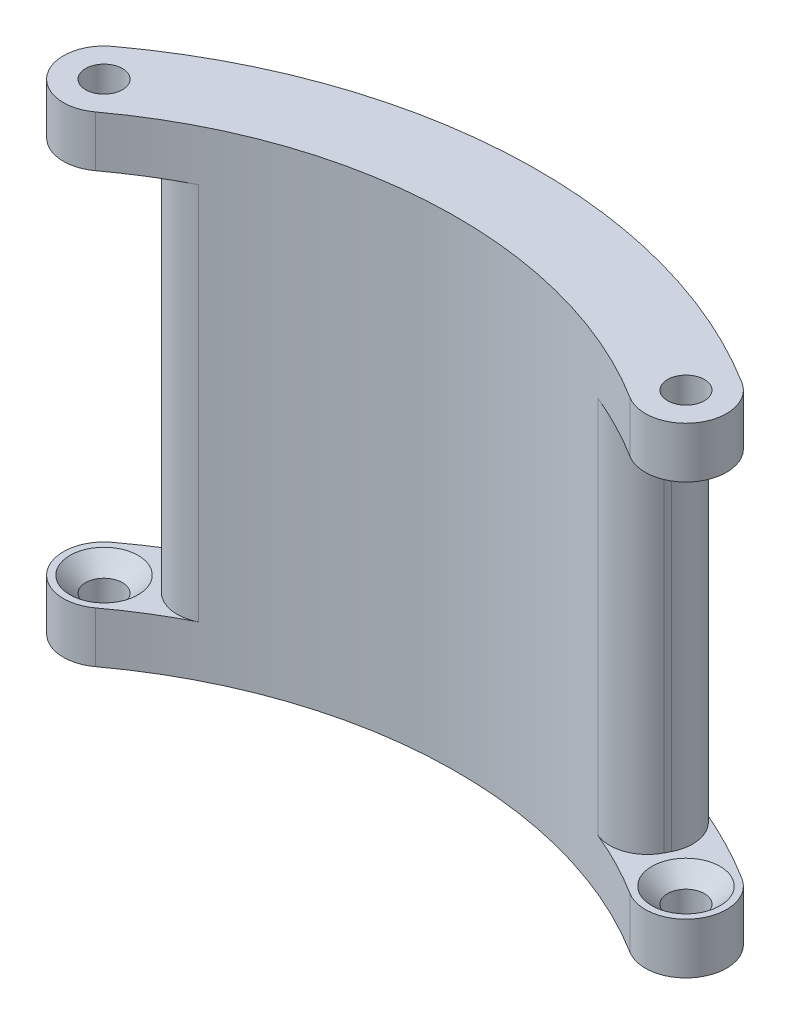
ISO-10303-21;
HEADER;
FILE_DESCRIPTION(('STEP AP214'),'2;1');
FILE_NAME('part.step','',(''),(''),'','','');
FILE_SCHEMA(('AUTOMOTIVE_DESIGN { 1 0 10303 214 1 1 1 1 }'));
ENDSEC;
DATA;
#1=APPLICATION_CONTEXT('core data for automotive mechanical design processes');
#2=APPLICATION_PROTOCOL_DEFINITION('international standard','automotive_design',2000,#1);
#3=PRODUCT_CONTEXT('',#1,'mechanical');
#4=PRODUCT('Part','Part','',(#3));
#5=PRODUCT_RELATED_PRODUCT_CATEGORY('part','',(#4));
#6=PRODUCT_DEFINITION_FORMATION('','',#4);
#7=PRODUCT_DEFINITION_CONTEXT('part definition',#1,'design');
#8=PRODUCT_DEFINITION('design','',#6,#7);
#9=PRODUCT_DEFINITION_SHAPE('','',#8);
#10=(LENGTH_UNIT() NAMED_UNIT(*) SI_UNIT(.MILLI.,.METRE.));
#11=(NAMED_UNIT(*) PLANE_ANGLE_UNIT() SI_UNIT($,.RADIAN.));
#12=(NAMED_UNIT(*) SI_UNIT($,.STERADIAN.) SOLID_ANGLE_UNIT());
#13=UNCERTAINTY_MEASURE_WITH_UNIT(LENGTH_MEASURE(1.E-05),#10,'distance_accuracy_value','');
#14=(GEOMETRIC_REPRESENTATION_CONTEXT(3) GLOBAL_UNCERTAINTY_ASSIGNED_CONTEXT((#13)) GLOBAL_UNIT_ASSIGNED_CONTEXT((#10,
#11,#12)) REPRESENTATION_CONTEXT('',''));
#15=CARTESIAN_POINT('',(0.,0.,0.));
#16=DIRECTION('',(0.,0.,1.));
#17=DIRECTION('',(1.,0.,0.));
#18=AXIS2_PLACEMENT_3D('',#15,#16,#17);
#19=CARTESIAN_POINT('',(12.1963109176505,4.699,-19.5));
#20=DIRECTION('',(0.,-1.,0.));
#21=DIRECTION('',(0.,0.,-1.));
#22=AXIS2_PLACEMENT_3D('',#19,#20,#21);
#23=PLANE('',#22);
#24=CARTESIAN_POINT('',(24.3926218353009,4.69899999999995,-39.));
#25=DIRECTION('',(0.,1.,0.));
#26=DIRECTION('',(0.,0.,1.));
#27=AXIS2_PLACEMENT_3D('',#24,#25,#26);
#28=CIRCLE('',#27,3.15);
#29=CARTESIAN_POINT('',(24.3926218353009,4.69899999999995,-35.8500000000001));
#30=VERTEX_POINT('',#29);
#31=EDGE_CURVE('E215',#30,#30,#28,.T.);
#32=ORIENTED_EDGE('',*,*,#31,.F.);
#33=EDGE_LOOP('',(#32));
#34=FACE_BOUND('',#33,.T.);
#35=DIRECTION('',(0.454541757838843,0.,-0.890725429288271));
#36=VECTOR('',#35,1.);
#37=CARTESIAN_POINT('',(19.2043892686911,4.69899999999995,-37.6331493874295));
#38=LINE('',#37,#36);
#39=CARTESIAN_POINT('',(20.7343421689309,4.69899999999995,-40.6312632688389));
#40=VERTEX_POINT('',#39);
#41=CARTESIAN_POINT('',(20.9622737989176,4.69899999999995,-41.0779207991253));
#42=VERTEX_POINT('',#41);
#43=EDGE_CURVE('E204',#40,#42,#38,.T.);
#44=ORIENTED_EDGE('',*,*,#43,.F.);
#45=CARTESIAN_POINT('',(17.6168031664219,4.69899999999995,-42.2221594212748));
#46=DIRECTION('',(0.,-1.,0.));
#47=DIRECTION('',(0.,0.,-1.));
#48=AXIS2_PLACEMENT_3D('',#45,#46,#47);
#49=CIRCLE('',#48,3.5);
#50=CARTESIAN_POINT('',(16.2690695908486,4.69899999999995,-38.992048864456));
#51=VERTEX_POINT('',#50);
#52=EDGE_CURVE('E58',#40,#51,#49,.T.);
#53=ORIENTED_EDGE('',*,*,#52,.T.);
#54=CARTESIAN_POINT('',(0.,4.69900000000001,0.));
#55=DIRECTION('',(0.,-1.,0.));
#56=DIRECTION('',(0.,0.,-1.));
#57=AXIS2_PLACEMENT_3D('',#54,#55,#56);
#58=CIRCLE('',#57,42.25);
#59=CARTESIAN_POINT('',(22.4040928813362,4.69899999999995,-35.8206521739131));
#60=VERTEX_POINT('',#59);
#61=EDGE_CURVE('E228',#51,#60,#58,.T.);
#62=ORIENTED_EDGE('',*,*,#61,.T.);
#63=CARTESIAN_POINT('',(24.3926218353009,4.69899999999995,-39.));
#64=DIRECTION('',(0.,1.,0.));
#65=DIRECTION('',(0.,0.,-1.));
#66=AXIS2_PLACEMENT_3D('',#63,#64,#65);
#67=CIRCLE('',#66,3.75);
#68=CARTESIAN_POINT('',(26.3811507892657,4.69900000000001,-42.179347826087));
#69=VERTEX_POINT('',#68);
#70=EDGE_CURVE('E227',#60,#69,#67,.T.);
#71=ORIENTED_EDGE('',*,*,#70,.T.);
#72=CARTESIAN_POINT('',(0.,4.69900000000001,0.));
#73=DIRECTION('',(0.,1.,0.));
#74=DIRECTION('',(0.,0.,-1.));
#75=AXIS2_PLACEMENT_3D('',#72,#73,#74);
#76=CIRCLE('',#75,49.75);
#77=CARTESIAN_POINT('',(19.1951471593801,4.69900000000006,-45.8978085046524));
#78=VERTEX_POINT('',#77);
#79=EDGE_CURVE('E231',#69,#78,#76,.T.);
#80=ORIENTED_EDGE('',*,*,#79,.T.);
#81=CARTESIAN_POINT('',(17.8447347964087,4.69899999999995,-42.6688169515612));
#82=DIRECTION('',(0.,-1.,0.));
#83=DIRECTION('',(0.,0.,-1.));
#84=AXIS2_PLACEMENT_3D('',#81,#82,#83);
#85=CIRCLE('',#84,3.5);
#86=EDGE_CURVE('E44',#78,#42,#85,.T.);
#87=ORIENTED_EDGE('',*,*,#86,.T.);
#88=EDGE_LOOP('',(#44,#53,#62,#71,#80,#87));
#89=FACE_BOUND('',#88,.T.);
#90=ADVANCED_FACE('F36',(#34,#89),#23,.F.);
#91=CARTESIAN_POINT('',(-27.3313007374329,4.69899999999999,-37.));
#92=DIRECTION('',(0.,1.,0.));
#93=DIRECTION('',(0.,0.,1.));
#94=AXIS2_PLACEMENT_3D('',#91,#92,#93);
#95=CIRCLE('',#94,3.15);
#96=CARTESIAN_POINT('',(-27.3313007374329,4.69899999999999,-33.85));
#97=VERTEX_POINT('',#96);
#98=EDGE_CURVE('E206',#97,#97,#95,.T.);
#99=ORIENTED_EDGE('',*,*,#98,.F.);
#100=EDGE_LOOP('',(#99));
#101=FACE_BOUND('',#100,.T.);
#102=DIRECTION('',(0.521964813189454,0.,0.852967017997823));
#103=VECTOR('',#102,1.);
#104=CARTESIAN_POINT('',(-22.0530133572545,4.699,-36.037856510408));
#105=LINE('',#104,#103);
#106=CARTESIAN_POINT('',(-24.0716482892592,4.69899999999999,-39.3366018949046));
#107=VERTEX_POINT('',#106);
#108=CARTESIAN_POINT('',(-23.8099071211173,4.69899999999999,-38.908878458313));
#109=VERTEX_POINT('',#108);
#110=EDGE_CURVE('E163',#107,#109,#105,.T.);
#111=ORIENTED_EDGE('',*,*,#110,.F.);
#112=CARTESIAN_POINT('',(-21.0862637262669,4.69899999999999,-41.1634787410676));
#113=DIRECTION('',(0.,-1.,0.));
#114=DIRECTION('',(0.,0.,-1.));
#115=AXIS2_PLACEMENT_3D('',#112,#113,#114);
#116=CIRCLE('',#115,3.5);
#117=CARTESIAN_POINT('',(-22.6819809812275,4.699,-44.2785528079592));
#118=VERTEX_POINT('',#117);
#119=EDGE_CURVE('E278',#107,#118,#116,.T.);
#120=ORIENTED_EDGE('',*,*,#119,.T.);
#121=CARTESIAN_POINT('',(-29.5593959062454,4.69899999999999,-40.0163043478261));
#122=VERTEX_POINT('',#121);
#123=EDGE_CURVE('E230',#118,#122,#76,.T.);
#124=ORIENTED_EDGE('',*,*,#123,.T.);
#125=CARTESIAN_POINT('',(-27.3313007374329,4.69899999999999,-37.));
#126=DIRECTION('',(0.,1.,0.));
#127=DIRECTION('',(0.,0.,1.));
#128=AXIS2_PLACEMENT_3D('',#125,#126,#127);
#129=CIRCLE('',#128,3.75);
#130=CARTESIAN_POINT('',(-25.1032055686204,4.69899999999999,-33.983695652174));
#131=VERTEX_POINT('',#130);
#132=EDGE_CURVE('E233',#122,#131,#129,.T.);
#133=ORIENTED_EDGE('',*,*,#132,.T.);
#134=CARTESIAN_POINT('',(-19.2313896848257,4.69900000000001,-37.6193587238057));
#135=VERTEX_POINT('',#134);
#136=EDGE_CURVE('E225',#131,#135,#58,.T.);
#137=ORIENTED_EDGE('',*,*,#136,.T.);
#138=CARTESIAN_POINT('',(-20.8245225581249,4.69899999999999,-40.7357553044761));
#139=DIRECTION('',(0.,-1.,0.));
#140=DIRECTION('',(0.,0.,-1.));
#141=AXIS2_PLACEMENT_3D('',#138,#139,#140);
#142=CIRCLE('',#141,3.5);
#143=EDGE_CURVE('E273',#135,#109,#142,.T.);
#144=ORIENTED_EDGE('',*,*,#143,.T.);
#145=EDGE_LOOP('',(#111,#120,#124,#133,#137,#144));
#146=FACE_BOUND('',#145,.T.);
#147=ADVANCED_FACE('F307',(#101,#146),#23,.F.);
#148=CARTESIAN_POINT('',(0.,4.69900000000001,0.));
#149=DIRECTION('',(0.,-1.,0.));
#150=DIRECTION('',(0.,0.,-1.));
#151=AXIS2_PLACEMENT_3D('',#148,#149,#150);
#152=CYLINDRICAL_SURFACE('',#151,42.25);
#153=DIRECTION('',(0.,-1.,0.));
#154=VECTOR('',#153,1.);
#155=CARTESIAN_POINT('',(-19.2313896848257,4.69900000000001,-37.6193587238057));
#156=LINE('',#155,#154);
#157=CARTESIAN_POINT('',(-19.2313896848258,39.651,-37.6193587238058));
#158=VERTEX_POINT('',#157);
#159=EDGE_CURVE('E256',#158,#135,#156,.T.);
#160=ORIENTED_EDGE('',*,*,#159,.T.);
#161=ORIENTED_EDGE('',*,*,#136,.F.);
#162=DIRECTION('',(0.,-1.,0.));
#163=VECTOR('',#162,1.);
#164=CARTESIAN_POINT('',(-25.1032055686204,4.69899999999999,-33.983695652174));
#165=LINE('',#164,#163);
#166=CARTESIAN_POINT('',(-25.1032055686205,0.,-33.983695652174));
#167=VERTEX_POINT('',#166);
#168=EDGE_CURVE('E235',#131,#167,#165,.T.);
#169=ORIENTED_EDGE('',*,*,#168,.T.);
#170=CARTESIAN_POINT('',(0.,0.,0.));
#171=DIRECTION('',(0.,-1.,0.));
#172=DIRECTION('',(0.,0.,-1.));
#173=AXIS2_PLACEMENT_3D('',#170,#171,#172);
#174=CIRCLE('',#173,42.25);
#175=CARTESIAN_POINT('',(22.4040928813362,0.,-35.8206521739131));
#176=VERTEX_POINT('',#175);
#177=EDGE_CURVE('E224',#167,#176,#174,.T.);
#178=ORIENTED_EDGE('',*,*,#177,.T.);
#179=DIRECTION('',(0.,-1.,0.));
#180=VECTOR('',#179,1.);
#181=CARTESIAN_POINT('',(22.4040928813362,4.69899999999995,-35.8206521739131));
#182=LINE('',#181,#180);
#183=EDGE_CURVE('E252',#60,#176,#182,.T.);
#184=ORIENTED_EDGE('',*,*,#183,.F.);
#185=ORIENTED_EDGE('',*,*,#61,.F.);
#186=DIRECTION('',(0.,-1.,0.));
#187=VECTOR('',#186,1.);
#188=CARTESIAN_POINT('',(16.2690695908486,4.69899999999995,-38.992048864456));
#189=LINE('',#188,#187);
#190=CARTESIAN_POINT('',(16.2690695908486,39.651,-38.992048864456));
#191=VERTEX_POINT('',#190);
#192=EDGE_CURVE('E170',#51,#191,#189,.F.);
#193=ORIENTED_EDGE('',*,*,#192,.T.);
#194=CARTESIAN_POINT('',(0.,39.651,0.));
#195=DIRECTION('',(0.,-1.,0.));
#196=DIRECTION('',(0.,0.,-1.));
#197=AXIS2_PLACEMENT_3D('',#194,#195,#196);
#198=CIRCLE('',#197,42.25);
#199=CARTESIAN_POINT('',(22.4040928813362,39.651,-35.8206521739131));
#200=VERTEX_POINT('',#199);
#201=EDGE_CURVE('E167',#191,#200,#198,.T.);
#202=ORIENTED_EDGE('',*,*,#201,.T.);
#203=DIRECTION('',(0.,1.,0.));
#204=VECTOR('',#203,1.);
#205=CARTESIAN_POINT('',(22.4040928813362,39.651,-35.8206521739131));
#206=LINE('',#205,#204);
#207=CARTESIAN_POINT('',(22.4040928813361,44.35,-35.8206521739131));
#208=VERTEX_POINT('',#207);
#209=EDGE_CURVE('E151',#200,#208,#206,.T.);
#210=ORIENTED_EDGE('',*,*,#209,.T.);
#211=CARTESIAN_POINT('',(0.,44.35,0.));
#212=DIRECTION('',(0.,-1.,0.));
#213=DIRECTION('',(0.,0.,-1.));
#214=AXIS2_PLACEMENT_3D('',#211,#212,#213);
#215=CIRCLE('',#214,42.25);
#216=CARTESIAN_POINT('',(-25.1032055686205,44.35,-33.983695652174));
#217=VERTEX_POINT('',#216);
#218=EDGE_CURVE('E188',#217,#208,#215,.T.);
#219=ORIENTED_EDGE('',*,*,#218,.F.);
#220=DIRECTION('',(0.,1.,0.));
#221=VECTOR('',#220,1.);
#222=CARTESIAN_POINT('',(-25.1032055686204,39.651,-33.9836956521739));
#223=LINE('',#222,#221);
#224=CARTESIAN_POINT('',(-25.1032055686204,39.651,-33.9836956521739));
#225=VERTEX_POINT('',#224);
#226=EDGE_CURVE('E187',#225,#217,#223,.T.);
#227=ORIENTED_EDGE('',*,*,#226,.F.);
#228=EDGE_CURVE('E173',#225,#158,#198,.T.);
#229=ORIENTED_EDGE('',*,*,#228,.T.);
#230=EDGE_LOOP('',(#160,#161,#169,#178,#184,#185,#193,#202,#210,#219,#227,#229));
#231=FACE_BOUND('',#230,.T.);
#232=ADVANCED_FACE('F169',(#231),#152,.F.);
#233=CARTESIAN_POINT('',(24.3926218353009,4.69899999999995,-39.));
#234=DIRECTION('',(0.,-1.,0.));
#235=DIRECTION('',(0.,0.,-1.));
#236=AXIS2_PLACEMENT_3D('',#233,#234,#235);
#237=CYLINDRICAL_SURFACE('',#236,3.75);
#238=CARTESIAN_POINT('',(24.3926218353009,0.,-39.));
#239=DIRECTION('',(0.,1.,0.));
#240=DIRECTION('',(0.,0.,-1.));
#241=AXIS2_PLACEMENT_3D('',#238,#239,#240);
#242=CIRCLE('',#241,3.75);
#243=CARTESIAN_POINT('',(26.3811507892656,0.,-42.179347826087));
#244=VERTEX_POINT('',#243);
#245=EDGE_CURVE('E238',#176,#244,#242,.T.);
#246=ORIENTED_EDGE('',*,*,#245,.T.);
#247=DIRECTION('',(0.,-1.,0.));
#248=VECTOR('',#247,1.);
#249=CARTESIAN_POINT('',(26.3811507892657,4.69900000000001,-42.179347826087));
#250=LINE('',#249,#248);
#251=EDGE_CURVE('E249',#69,#244,#250,.T.);
#252=ORIENTED_EDGE('',*,*,#251,.F.);
#253=ORIENTED_EDGE('',*,*,#70,.F.);
#254=ORIENTED_EDGE('',*,*,#183,.T.);
#255=EDGE_LOOP('',(#246,#252,#253,#254));
#256=FACE_BOUND('',#255,.T.);
#257=ADVANCED_FACE('F330',(#256),#237,.T.);
#258=CARTESIAN_POINT('',(0.,4.69900000000001,0.));
#259=DIRECTION('',(0.,-1.,0.));
#260=DIRECTION('',(0.,0.,-1.));
#261=AXIS2_PLACEMENT_3D('',#258,#259,#260);
#262=CYLINDRICAL_SURFACE('',#261,49.75);
#263=ORIENTED_EDGE('',*,*,#123,.F.);
#264=DIRECTION('',(0.,-1.,0.));
#265=VECTOR('',#264,1.);
#266=CARTESIAN_POINT('',(-22.6819809812275,4.699,-44.2785528079592));
#267=LINE('',#266,#265);
#268=CARTESIAN_POINT('',(-22.6819809812275,39.651,-44.2785528079592));
#269=VERTEX_POINT('',#268);
#270=EDGE_CURVE('E266',#118,#269,#267,.F.);
#271=ORIENTED_EDGE('',*,*,#270,.T.);
#272=CARTESIAN_POINT('',(0.,39.651,0.));
#273=DIRECTION('',(0.,1.,0.));
#274=DIRECTION('',(0.,0.,-1.));
#275=AXIS2_PLACEMENT_3D('',#272,#273,#274);
#276=CIRCLE('',#275,49.75);
#277=CARTESIAN_POINT('',(-29.5593959062454,39.651,-40.0163043478261));
#278=VERTEX_POINT('',#277);
#279=EDGE_CURVE('E178',#269,#278,#276,.T.);
#280=ORIENTED_EDGE('',*,*,#279,.T.);
#281=DIRECTION('',(0.,1.,0.));
#282=VECTOR('',#281,1.);
#283=CARTESIAN_POINT('',(-29.5593959062454,39.651,-40.0163043478261));
#284=LINE('',#283,#282);
#285=CARTESIAN_POINT('',(-29.5593959062454,44.3500000000001,-40.0163043478262));
#286=VERTEX_POINT('',#285);
#287=EDGE_CURVE('E198',#278,#286,#284,.T.);
#288=ORIENTED_EDGE('',*,*,#287,.T.);
#289=CARTESIAN_POINT('',(0.,44.35,0.));
#290=DIRECTION('',(0.,1.,0.));
#291=DIRECTION('',(0.,0.,-1.));
#292=AXIS2_PLACEMENT_3D('',#289,#290,#291);
#293=CIRCLE('',#292,49.75);
#294=CARTESIAN_POINT('',(26.3811507892656,44.35,-42.179347826087));
#295=VERTEX_POINT('',#294);
#296=EDGE_CURVE('E192',#295,#286,#293,.T.);
#297=ORIENTED_EDGE('',*,*,#296,.F.);
#298=DIRECTION('',(0.,1.,0.));
#299=VECTOR('',#298,1.);
#300=CARTESIAN_POINT('',(26.3811507892657,39.651,-42.179347826087));
#301=LINE('',#300,#299);
#302=CARTESIAN_POINT('',(26.3811507892657,39.651,-42.179347826087));
#303=VERTEX_POINT('',#302);
#304=EDGE_CURVE('E164',#303,#295,#301,.T.);
#305=ORIENTED_EDGE('',*,*,#304,.F.);
#306=CARTESIAN_POINT('',(19.1951471593801,39.651,-45.8978085046524));
#307=VERTEX_POINT('',#306);
#308=EDGE_CURVE('E177',#303,#307,#276,.T.);
#309=ORIENTED_EDGE('',*,*,#308,.T.);
#310=DIRECTION('',(0.,-1.,0.));
#311=VECTOR('',#310,1.);
#312=CARTESIAN_POINT('',(19.1951471593802,4.69900000000006,-45.8978085046524));
#313=LINE('',#312,#311);
#314=EDGE_CURVE('E263',#307,#78,#313,.T.);
#315=ORIENTED_EDGE('',*,*,#314,.T.);
#316=ORIENTED_EDGE('',*,*,#79,.F.);
#317=ORIENTED_EDGE('',*,*,#251,.T.);
#318=CARTESIAN_POINT('',(0.,0.,0.));
#319=DIRECTION('',(0.,1.,0.));
#320=DIRECTION('',(0.,0.,-1.));
#321=AXIS2_PLACEMENT_3D('',#318,#319,#320);
#322=CIRCLE('',#321,49.75);
#323=CARTESIAN_POINT('',(-29.5593959062454,0.,-40.0163043478261));
#324=VERTEX_POINT('',#323);
#325=EDGE_CURVE('E240',#244,#324,#322,.T.);
#326=ORIENTED_EDGE('',*,*,#325,.T.);
#327=DIRECTION('',(0.,-1.,0.));
#328=VECTOR('',#327,1.);
#329=CARTESIAN_POINT('',(-29.5593959062454,4.69899999999999,-40.0163043478261));
#330=LINE('',#329,#328);
#331=EDGE_CURVE('E246',#122,#324,#330,.T.);
#332=ORIENTED_EDGE('',*,*,#331,.F.);
#333=EDGE_LOOP('',(#263,#271,#280,#288,#297,#305,#309,#315,#316,#317,#326,#332));
#334=FACE_BOUND('',#333,.T.);
#335=ADVANCED_FACE('F326',(#334),#262,.T.);
#336=CARTESIAN_POINT('',(-27.3313007374329,4.69899999999999,-37.));
#337=DIRECTION('',(0.,-1.,0.));
#338=DIRECTION('',(0.,0.,-1.));
#339=AXIS2_PLACEMENT_3D('',#336,#337,#338);
#340=CYLINDRICAL_SURFACE('',#339,3.75);
#341=CARTESIAN_POINT('',(-27.331300737433,0.,-37.0000000000001));
#342=DIRECTION('',(0.,1.,0.));
#343=DIRECTION('',(0.,0.,1.));
#344=AXIS2_PLACEMENT_3D('',#341,#342,#343);
#345=CIRCLE('',#344,3.75);
#346=EDGE_CURVE('E242',#324,#167,#345,.T.);
#347=ORIENTED_EDGE('',*,*,#346,.T.);
#348=ORIENTED_EDGE('',*,*,#168,.F.);
#349=ORIENTED_EDGE('',*,*,#132,.F.);
#350=ORIENTED_EDGE('',*,*,#331,.T.);
#351=EDGE_LOOP('',(#347,#348,#349,#350));
#352=FACE_BOUND('',#351,.T.);
#353=ADVANCED_FACE('F322',(#352),#340,.T.);
#354=CARTESIAN_POINT('',(12.1963109176504,0.,-19.4999999999999));
#355=DIRECTION('',(0.,-1.,0.));
#356=DIRECTION('',(0.,0.,-1.));
#357=AXIS2_PLACEMENT_3D('',#354,#355,#356);
#358=PLANE('',#357);
#359=CARTESIAN_POINT('',(-27.331300737433,0.,-37.0000000000001));
#360=DIRECTION('',(0.,1.,0.));
#361=DIRECTION('',(0.,0.,1.));
#362=AXIS2_PLACEMENT_3D('',#359,#360,#361);
#363=CIRCLE('',#362,1.7);
#364=CARTESIAN_POINT('',(-27.331300737433,0.,-35.3000000000001));
#365=VERTEX_POINT('',#364);
#366=EDGE_CURVE('E212',#365,#365,#363,.T.);
#367=ORIENTED_EDGE('',*,*,#366,.T.);
#368=EDGE_LOOP('',(#367));
#369=FACE_BOUND('',#368,.T.);
#370=CARTESIAN_POINT('',(24.3926218353009,0.,-39.));
#371=DIRECTION('',(0.,1.,0.));
#372=DIRECTION('',(0.,0.,1.));
#373=AXIS2_PLACEMENT_3D('',#370,#371,#372);
#374=CIRCLE('',#373,1.7);
#375=CARTESIAN_POINT('',(24.3926218353009,0.,-37.3));
#376=VERTEX_POINT('',#375);
#377=EDGE_CURVE('E221',#376,#376,#374,.T.);
#378=ORIENTED_EDGE('',*,*,#377,.T.);
#379=EDGE_LOOP('',(#378));
#380=FACE_BOUND('',#379,.T.);
#381=ORIENTED_EDGE('',*,*,#177,.F.);
#382=ORIENTED_EDGE('',*,*,#346,.F.);
#383=ORIENTED_EDGE('',*,*,#325,.F.);
#384=ORIENTED_EDGE('',*,*,#245,.F.);
#385=EDGE_LOOP('',(#381,#382,#383,#384));
#386=FACE_BOUND('',#385,.T.);
#387=ADVANCED_FACE('F319',(#369,#380,#386),#358,.T.);
#388=CARTESIAN_POINT('',(24.3926218353009,4.69899999999995,-39.));
#389=DIRECTION('',(0.,1.,0.));
#390=DIRECTION('',(0.,0.,1.));
#391=AXIS2_PLACEMENT_3D('',#388,#389,#390);
#392=CYLINDRICAL_SURFACE('',#391,1.7);
#393=ORIENTED_EDGE('',*,*,#377,.F.);
#394=EDGE_LOOP('',(#393));
#395=FACE_BOUND('',#394,.T.);
#396=CARTESIAN_POINT('',(24.3926218353009,3.24899999999995,-39.));
#397=DIRECTION('',(0.,1.,0.));
#398=DIRECTION('',(0.,0.,1.));
#399=AXIS2_PLACEMENT_3D('',#396,#397,#398);
#400=CIRCLE('',#399,1.7);
#401=CARTESIAN_POINT('',(24.3926218353009,3.24899999999995,-37.3));
#402=VERTEX_POINT('',#401);
#403=EDGE_CURVE('E218',#402,#402,#400,.T.);
#404=ORIENTED_EDGE('',*,*,#403,.T.);
#405=EDGE_LOOP('',(#404));
#406=FACE_BOUND('',#405,.T.);
#407=ADVANCED_FACE('F317',(#395,#406),#392,.F.);
#408=CARTESIAN_POINT('',(24.3926218353009,4.69899999999995,-39.));
#409=DIRECTION('',(0.,1.,0.));
#410=DIRECTION('',(0.,0.,1.));
#411=AXIS2_PLACEMENT_3D('',#408,#409,#410);
#412=CONICAL_SURFACE('',#411,3.15,0.785398163397448);
#413=ORIENTED_EDGE('',*,*,#403,.F.);
#414=EDGE_LOOP('',(#413));
#415=FACE_BOUND('',#414,.T.);
#416=ORIENTED_EDGE('',*,*,#31,.T.);
#417=EDGE_LOOP('',(#416));
#418=FACE_BOUND('',#417,.T.);
#419=ADVANCED_FACE('F421',(#415,#418),#412,.F.);
#420=CARTESIAN_POINT('',(-27.3313007374329,4.69899999999999,-37.));
#421=DIRECTION('',(0.,1.,0.));
#422=DIRECTION('',(0.,0.,1.));
#423=AXIS2_PLACEMENT_3D('',#420,#421,#422);
#424=CYLINDRICAL_SURFACE('',#423,1.7);
#425=ORIENTED_EDGE('',*,*,#366,.F.);
#426=EDGE_LOOP('',(#425));
#427=FACE_BOUND('',#426,.T.);
#428=CARTESIAN_POINT('',(-27.3313007374329,3.24899999999999,-37.));
#429=DIRECTION('',(0.,1.,0.));
#430=DIRECTION('',(0.,0.,1.));
#431=AXIS2_PLACEMENT_3D('',#428,#429,#430);
#432=CIRCLE('',#431,1.7);
#433=CARTESIAN_POINT('',(-27.3313007374329,3.24899999999999,-35.3));
#434=VERTEX_POINT('',#433);
#435=EDGE_CURVE('E209',#434,#434,#432,.T.);
#436=ORIENTED_EDGE('',*,*,#435,.T.);
#437=EDGE_LOOP('',(#436));
#438=FACE_BOUND('',#437,.T.);
#439=ADVANCED_FACE('F418',(#427,#438),#424,.F.);
#440=CARTESIAN_POINT('',(-27.3313007374329,4.69899999999999,-37.));
#441=DIRECTION('',(0.,1.,0.));
#442=DIRECTION('',(0.,0.,1.));
#443=AXIS2_PLACEMENT_3D('',#440,#441,#442);
#444=CONICAL_SURFACE('',#443,3.15,0.785398163397448);
#445=ORIENTED_EDGE('',*,*,#435,.F.);
#446=EDGE_LOOP('',(#445));
#447=FACE_BOUND('',#446,.T.);
#448=ORIENTED_EDGE('',*,*,#98,.T.);
#449=EDGE_LOOP('',(#448));
#450=FACE_BOUND('',#449,.T.);
#451=ADVANCED_FACE('F412',(#447,#450),#444,.F.);
#452=CARTESIAN_POINT('',(19.2043892686911,94.8292636432915,-37.6331493874294));
#453=DIRECTION('',(-0.890725429288271,0.,-0.454541757838843));
#454=DIRECTION('',(-0.454541757838843,0.,0.890725429288271));
#455=AXIS2_PLACEMENT_3D('',#452,#453,#454);
#456=PLANE('',#455);
#457=DIRECTION('',(0.454541757838843,0.,-0.890725429288271));
#458=VECTOR('',#457,1.);
#459=CARTESIAN_POINT('',(19.2043892686911,39.651,-37.6331493874294));
#460=LINE('',#459,#458);
#461=CARTESIAN_POINT('',(20.7343421689309,39.651,-40.6312632688389));
#462=VERTEX_POINT('',#461);
#463=CARTESIAN_POINT('',(20.9622737989176,39.651,-41.0779207991253));
#464=VERTEX_POINT('',#463);
#465=EDGE_CURVE('E287',#462,#464,#460,.T.);
#466=ORIENTED_EDGE('',*,*,#465,.F.);
#467=DIRECTION('',(0.,-1.,0.));
#468=VECTOR('',#467,1.);
#469=CARTESIAN_POINT('',(20.7343421689309,94.8292636432915,-40.6312632688389));
#470=LINE('',#469,#468);
#471=EDGE_CURVE('E271',#462,#40,#470,.T.);
#472=ORIENTED_EDGE('',*,*,#471,.T.);
#473=ORIENTED_EDGE('',*,*,#43,.T.);
#474=DIRECTION('',(0.,-1.,0.));
#475=VECTOR('',#474,1.);
#476=CARTESIAN_POINT('',(20.9622737989176,94.8292636432915,-41.0779207991253));
#477=LINE('',#476,#475);
#478=EDGE_CURVE('E269',#42,#464,#477,.F.);
#479=ORIENTED_EDGE('',*,*,#478,.T.);
#480=EDGE_LOOP('',(#466,#472,#473,#479));
#481=FACE_BOUND('',#480,.T.);
#482=ADVANCED_FACE('F290',(#481),#456,.F.);
#483=CARTESIAN_POINT('',(-22.0530133572545,94.8292636432916,-36.037856510408));
#484=DIRECTION('',(0.852967017997823,0.,-0.521964813189454));
#485=DIRECTION('',(-0.521964813189454,0.,-0.852967017997823));
#486=AXIS2_PLACEMENT_3D('',#483,#484,#485);
#487=PLANE('',#486);
#488=ORIENTED_EDGE('',*,*,#110,.T.);
#489=DIRECTION('',(0.,-1.,0.));
#490=VECTOR('',#489,1.);
#491=CARTESIAN_POINT('',(-23.8099071211173,94.8292636432916,-38.908878458313));
#492=LINE('',#491,#490);
#493=CARTESIAN_POINT('',(-23.8099071211173,39.651,-38.908878458313));
#494=VERTEX_POINT('',#493);
#495=EDGE_CURVE('E261',#109,#494,#492,.F.);
#496=ORIENTED_EDGE('',*,*,#495,.T.);
#497=DIRECTION('',(0.521964813189454,0.,0.852967017997823));
#498=VECTOR('',#497,1.);
#499=CARTESIAN_POINT('',(-22.0530133572545,39.651,-36.0378565104081));
#500=LINE('',#499,#498);
#501=CARTESIAN_POINT('',(-24.0716482892592,39.651,-39.3366018949046));
#502=VERTEX_POINT('',#501);
#503=EDGE_CURVE('E293',#502,#494,#500,.T.);
#504=ORIENTED_EDGE('',*,*,#503,.F.);
#505=DIRECTION('',(0.,-1.,0.));
#506=VECTOR('',#505,1.);
#507=CARTESIAN_POINT('',(-24.0716482892592,94.8292636432916,-39.3366018949045));
#508=LINE('',#507,#506);
#509=EDGE_CURVE('E258',#502,#107,#508,.T.);
#510=ORIENTED_EDGE('',*,*,#509,.T.);
#511=EDGE_LOOP('',(#488,#496,#504,#510));
#512=FACE_BOUND('',#511,.T.);
#513=ADVANCED_FACE('F390',(#512),#487,.F.);
#514=CARTESIAN_POINT('',(12.1963109176505,39.651,-19.5));
#515=DIRECTION('',(0.,1.,0.));
#516=DIRECTION('',(0.,0.,-1.));
#517=AXIS2_PLACEMENT_3D('',#514,#515,#516);
#518=PLANE('',#517);
#519=CARTESIAN_POINT('',(24.3926218353009,39.651,-39.));
#520=DIRECTION('',(0.,1.,0.));
#521=DIRECTION('',(0.,0.,1.));
#522=AXIS2_PLACEMENT_3D('',#519,#520,#521);
#523=CIRCLE('',#522,3.15);
#524=CARTESIAN_POINT('',(24.3926218353009,39.651,-35.85));
#525=VERTEX_POINT('',#524);
#526=EDGE_CURVE('E369',#525,#525,#523,.T.);
#527=ORIENTED_EDGE('',*,*,#526,.T.);
#528=EDGE_LOOP('',(#527));
#529=FACE_BOUND('',#528,.T.);
#530=ORIENTED_EDGE('',*,*,#201,.F.);
#531=CARTESIAN_POINT('',(17.6168031664219,39.651,-42.2221594212748));
#532=DIRECTION('',(0.,1.,0.));
#533=DIRECTION('',(0.,0.,1.));
#534=AXIS2_PLACEMENT_3D('',#531,#532,#533);
#535=CIRCLE('',#534,3.5);
#536=EDGE_CURVE('E284',#191,#462,#535,.T.);
#537=ORIENTED_EDGE('',*,*,#536,.T.);
#538=ORIENTED_EDGE('',*,*,#465,.T.);
#539=CARTESIAN_POINT('',(17.8447347964087,39.651,-42.6688169515612));
#540=DIRECTION('',(0.,1.,0.));
#541=DIRECTION('',(0.,0.,1.));
#542=AXIS2_PLACEMENT_3D('',#539,#540,#541);
#543=CIRCLE('',#542,3.5);
#544=EDGE_CURVE('E12',#464,#307,#543,.T.);
#545=ORIENTED_EDGE('',*,*,#544,.T.);
#546=ORIENTED_EDGE('',*,*,#308,.F.);
#547=CARTESIAN_POINT('',(24.3926218353009,39.651,-39.));
#548=DIRECTION('',(0.,1.,0.));
#549=DIRECTION('',(0.,0.,-1.));
#550=AXIS2_PLACEMENT_3D('',#547,#548,#549);
#551=CIRCLE('',#550,3.75);
#552=EDGE_CURVE('E156',#200,#303,#551,.T.);
#553=ORIENTED_EDGE('',*,*,#552,.F.);
#554=EDGE_LOOP('',(#530,#537,#538,#545,#546,#553));
#555=FACE_BOUND('',#554,.T.);
#556=ADVANCED_FACE('F176',(#529,#555),#518,.F.);
#557=CARTESIAN_POINT('',(-27.3313007374329,39.651,-37.0000000000001));
#558=DIRECTION('',(0.,1.,0.));
#559=DIRECTION('',(0.,0.,1.));
#560=AXIS2_PLACEMENT_3D('',#557,#558,#559);
#561=CIRCLE('',#560,3.15);
#562=CARTESIAN_POINT('',(-27.3313007374329,39.651,-33.8500000000001));
#563=VERTEX_POINT('',#562);
#564=EDGE_CURVE('E292',#563,#563,#561,.T.);
#565=ORIENTED_EDGE('',*,*,#564,.T.);
#566=EDGE_LOOP('',(#565));
#567=FACE_BOUND('',#566,.T.);
#568=ORIENTED_EDGE('',*,*,#279,.F.);
#569=CARTESIAN_POINT('',(-21.0862637262669,39.651,-41.1634787410676));
#570=DIRECTION('',(0.,1.,0.));
#571=DIRECTION('',(0.,0.,1.));
#572=AXIS2_PLACEMENT_3D('',#569,#570,#571);
#573=CIRCLE('',#572,3.5);
#574=EDGE_CURVE('E281',#269,#502,#573,.T.);
#575=ORIENTED_EDGE('',*,*,#574,.T.);
#576=ORIENTED_EDGE('',*,*,#503,.T.);
#577=CARTESIAN_POINT('',(-20.824522558125,39.651,-40.7357553044761));
#578=DIRECTION('',(0.,1.,0.));
#579=DIRECTION('',(0.,0.,1.));
#580=AXIS2_PLACEMENT_3D('',#577,#578,#579);
#581=CIRCLE('',#580,3.5);
#582=EDGE_CURVE('E275',#494,#158,#581,.T.);
#583=ORIENTED_EDGE('',*,*,#582,.T.);
#584=ORIENTED_EDGE('',*,*,#228,.F.);
#585=CARTESIAN_POINT('',(-27.3313007374329,39.651,-37.0000000000001));
#586=DIRECTION('',(0.,1.,0.));
#587=DIRECTION('',(0.,0.,1.));
#588=AXIS2_PLACEMENT_3D('',#585,#586,#587);
#589=CIRCLE('',#588,3.75);
#590=EDGE_CURVE('E184',#278,#225,#589,.T.);
#591=ORIENTED_EDGE('',*,*,#590,.F.);
#592=EDGE_LOOP('',(#568,#575,#576,#583,#584,#591));
#593=FACE_BOUND('',#592,.T.);
#594=ADVANCED_FACE('F353',(#567,#593),#518,.F.);
#595=CARTESIAN_POINT('',(24.3926218353009,39.651,-39.));
#596=DIRECTION('',(0.,1.,0.));
#597=DIRECTION('',(0.,0.,-1.));
#598=AXIS2_PLACEMENT_3D('',#595,#596,#597);
#599=CYLINDRICAL_SURFACE('',#598,3.75);
#600=CARTESIAN_POINT('',(24.3926218353009,44.35,-39.));
#601=DIRECTION('',(0.,1.,0.));
#602=DIRECTION('',(0.,0.,-1.));
#603=AXIS2_PLACEMENT_3D('',#600,#601,#602);
#604=CIRCLE('',#603,3.75);
#605=EDGE_CURVE('E159',#208,#295,#604,.T.);
#606=ORIENTED_EDGE('',*,*,#605,.F.);
#607=ORIENTED_EDGE('',*,*,#209,.F.);
#608=ORIENTED_EDGE('',*,*,#552,.T.);
#609=ORIENTED_EDGE('',*,*,#304,.T.);
#610=EDGE_LOOP('',(#606,#607,#608,#609));
#611=FACE_BOUND('',#610,.T.);
#612=ADVANCED_FACE('F153',(#611),#599,.T.);
#613=CARTESIAN_POINT('',(-27.3313007374329,39.651,-37.0000000000001));
#614=DIRECTION('',(0.,1.,0.));
#615=DIRECTION('',(0.,0.,-1.));
#616=AXIS2_PLACEMENT_3D('',#613,#614,#615);
#617=CYLINDRICAL_SURFACE('',#616,3.75);
#618=CARTESIAN_POINT('',(-27.3313007374329,44.35,-37.0000000000001));
#619=DIRECTION('',(0.,1.,0.));
#620=DIRECTION('',(0.,0.,1.));
#621=AXIS2_PLACEMENT_3D('',#618,#619,#620);
#622=CIRCLE('',#621,3.75);
#623=EDGE_CURVE('E174',#286,#217,#622,.T.);
#624=ORIENTED_EDGE('',*,*,#623,.F.);
#625=ORIENTED_EDGE('',*,*,#287,.F.);
#626=ORIENTED_EDGE('',*,*,#590,.T.);
#627=ORIENTED_EDGE('',*,*,#226,.T.);
#628=EDGE_LOOP('',(#624,#625,#626,#627));
#629=FACE_BOUND('',#628,.T.);
#630=ADVANCED_FACE('F383',(#629),#617,.T.);
#631=CARTESIAN_POINT('',(12.1963109176505,44.35,-19.5));
#632=DIRECTION('',(0.,1.,0.));
#633=DIRECTION('',(0.,0.,-1.));
#634=AXIS2_PLACEMENT_3D('',#631,#632,#633);
#635=PLANE('',#634);
#636=CARTESIAN_POINT('',(-27.3313007374329,44.35,-37.0000000000001));
#637=DIRECTION('',(0.,1.,0.));
#638=DIRECTION('',(0.,0.,1.));
#639=AXIS2_PLACEMENT_3D('',#636,#637,#638);
#640=CIRCLE('',#639,1.7);
#641=CARTESIAN_POINT('',(-27.3313007374329,44.35,-35.3000000000001));
#642=VERTEX_POINT('',#641);
#643=EDGE_CURVE('E366',#642,#642,#640,.T.);
#644=ORIENTED_EDGE('',*,*,#643,.F.);
#645=EDGE_LOOP('',(#644));
#646=FACE_BOUND('',#645,.T.);
#647=CARTESIAN_POINT('',(24.3926218353009,44.35,-39.));
#648=DIRECTION('',(0.,1.,0.));
#649=DIRECTION('',(0.,0.,1.));
#650=AXIS2_PLACEMENT_3D('',#647,#648,#649);
#651=CIRCLE('',#650,1.7);
#652=CARTESIAN_POINT('',(24.3926218353009,44.35,-37.3));
#653=VERTEX_POINT('',#652);
#654=EDGE_CURVE('E190',#653,#653,#651,.T.);
#655=ORIENTED_EDGE('',*,*,#654,.F.);
#656=EDGE_LOOP('',(#655));
#657=FACE_BOUND('',#656,.T.);
#658=ORIENTED_EDGE('',*,*,#218,.T.);
#659=ORIENTED_EDGE('',*,*,#605,.T.);
#660=ORIENTED_EDGE('',*,*,#296,.T.);
#661=ORIENTED_EDGE('',*,*,#623,.T.);
#662=EDGE_LOOP('',(#658,#659,#660,#661));
#663=FACE_BOUND('',#662,.T.);
#664=ADVANCED_FACE('F380',(#646,#657,#663),#635,.T.);
#665=CARTESIAN_POINT('',(24.3926218353009,39.651,-39.));
#666=DIRECTION('',(0.,-1.,0.));
#667=DIRECTION('',(0.,0.,1.));
#668=AXIS2_PLACEMENT_3D('',#665,#666,#667);
#669=CYLINDRICAL_SURFACE('',#668,1.7);
#670=ORIENTED_EDGE('',*,*,#654,.T.);
#671=EDGE_LOOP('',(#670));
#672=FACE_BOUND('',#671,.T.);
#673=CARTESIAN_POINT('',(24.3926218353009,41.1009999999999,-39.));
#674=DIRECTION('',(0.,1.,0.));
#675=DIRECTION('',(0.,0.,1.));
#676=AXIS2_PLACEMENT_3D('',#673,#674,#675);
#677=CIRCLE('',#676,1.7);
#678=CARTESIAN_POINT('',(24.3926218353009,41.1009999999999,-37.3));
#679=VERTEX_POINT('',#678);
#680=EDGE_CURVE('E372',#679,#679,#677,.T.);
#681=ORIENTED_EDGE('',*,*,#680,.F.);
#682=EDGE_LOOP('',(#681));
#683=FACE_BOUND('',#682,.T.);
#684=ADVANCED_FACE('F377',(#672,#683),#669,.F.);
#685=CARTESIAN_POINT('',(24.3926218353009,39.651,-39.));
#686=DIRECTION('',(0.,-1.,0.));
#687=DIRECTION('',(0.,0.,1.));
#688=AXIS2_PLACEMENT_3D('',#685,#686,#687);
#689=CONICAL_SURFACE('',#688,3.15,0.785398163397448);
#690=ORIENTED_EDGE('',*,*,#680,.T.);
#691=EDGE_LOOP('',(#690));
#692=FACE_BOUND('',#691,.T.);
#693=ORIENTED_EDGE('',*,*,#526,.F.);
#694=EDGE_LOOP('',(#693));
#695=FACE_BOUND('',#694,.T.);
#696=ADVANCED_FACE('F525',(#692,#695),#689,.F.);
#697=CARTESIAN_POINT('',(-27.3313007374329,39.651,-37.0000000000001));
#698=DIRECTION('',(0.,-1.,0.));
#699=DIRECTION('',(0.,0.,1.));
#700=AXIS2_PLACEMENT_3D('',#697,#698,#699);
#701=CYLINDRICAL_SURFACE('',#700,1.7);
#702=ORIENTED_EDGE('',*,*,#643,.T.);
#703=EDGE_LOOP('',(#702));
#704=FACE_BOUND('',#703,.T.);
#705=CARTESIAN_POINT('',(-27.3313007374329,41.101,-37.0000000000001));
#706=DIRECTION('',(0.,1.,0.));
#707=DIRECTION('',(0.,0.,1.));
#708=AXIS2_PLACEMENT_3D('',#705,#706,#707);
#709=CIRCLE('',#708,1.7);
#710=CARTESIAN_POINT('',(-27.3313007374329,41.101,-35.3000000000001));
#711=VERTEX_POINT('',#710);
#712=EDGE_CURVE('E363',#711,#711,#709,.T.);
#713=ORIENTED_EDGE('',*,*,#712,.F.);
#714=EDGE_LOOP('',(#713));
#715=FACE_BOUND('',#714,.T.);
#716=ADVANCED_FACE('F343',(#704,#715),#701,.F.);
#717=CARTESIAN_POINT('',(-27.3313007374329,39.651,-37.0000000000001));
#718=DIRECTION('',(0.,-1.,0.));
#719=DIRECTION('',(0.,0.,1.));
#720=AXIS2_PLACEMENT_3D('',#717,#718,#719);
#721=CONICAL_SURFACE('',#720,3.15,0.785398163397448);
#722=ORIENTED_EDGE('',*,*,#712,.T.);
#723=EDGE_LOOP('',(#722));
#724=FACE_BOUND('',#723,.T.);
#725=ORIENTED_EDGE('',*,*,#564,.F.);
#726=EDGE_LOOP('',(#725));
#727=FACE_BOUND('',#726,.T.);
#728=ADVANCED_FACE('F338',(#724,#727),#721,.F.);
#729=CARTESIAN_POINT('',(-20.8245225581249,4.69899999999999,-40.7357553044761));
#730=DIRECTION('',(0.,-1.,0.));
#731=DIRECTION('',(0.,0.,-1.));
#732=AXIS2_PLACEMENT_3D('',#729,#730,#731);
#733=CYLINDRICAL_SURFACE('',#732,3.5);
#734=ORIENTED_EDGE('',*,*,#582,.F.);
#735=ORIENTED_EDGE('',*,*,#495,.F.);
#736=ORIENTED_EDGE('',*,*,#143,.F.);
#737=ORIENTED_EDGE('',*,*,#159,.F.);
#738=EDGE_LOOP('',(#734,#735,#736,#737));
#739=FACE_BOUND('',#738,.T.);
#740=ADVANCED_FACE('F303',(#739),#733,.T.);
#741=CARTESIAN_POINT('',(-21.0862637262669,4.69899999999999,-41.1634787410676));
#742=DIRECTION('',(0.,-1.,0.));
#743=DIRECTION('',(0.,0.,-1.));
#744=AXIS2_PLACEMENT_3D('',#741,#742,#743);
#745=CYLINDRICAL_SURFACE('',#744,3.5);
#746=ORIENTED_EDGE('',*,*,#574,.F.);
#747=ORIENTED_EDGE('',*,*,#270,.F.);
#748=ORIENTED_EDGE('',*,*,#119,.F.);
#749=ORIENTED_EDGE('',*,*,#509,.F.);
#750=EDGE_LOOP('',(#746,#747,#748,#749));
#751=FACE_BOUND('',#750,.T.);
#752=ADVANCED_FACE('F297',(#751),#745,.T.);
#753=CARTESIAN_POINT('',(17.6168031664219,4.69899999999995,-42.2221594212748));
#754=DIRECTION('',(0.,-1.,0.));
#755=DIRECTION('',(0.,0.,-1.));
#756=AXIS2_PLACEMENT_3D('',#753,#754,#755);
#757=CYLINDRICAL_SURFACE('',#756,3.5);
#758=ORIENTED_EDGE('',*,*,#536,.F.);
#759=ORIENTED_EDGE('',*,*,#192,.F.);
#760=ORIENTED_EDGE('',*,*,#52,.F.);
#761=ORIENTED_EDGE('',*,*,#471,.F.);
#762=EDGE_LOOP('',(#758,#759,#760,#761));
#763=FACE_BOUND('',#762,.T.);
#764=ADVANCED_FACE('F295',(#763),#757,.T.);
#765=CARTESIAN_POINT('',(17.8447347964087,4.69899999999995,-42.6688169515612));
#766=DIRECTION('',(0.,-1.,0.));
#767=DIRECTION('',(0.,0.,-1.));
#768=AXIS2_PLACEMENT_3D('',#765,#766,#767);
#769=CYLINDRICAL_SURFACE('',#768,3.5);
#770=ORIENTED_EDGE('',*,*,#544,.F.);
#771=ORIENTED_EDGE('',*,*,#478,.F.);
#772=ORIENTED_EDGE('',*,*,#86,.F.);
#773=ORIENTED_EDGE('',*,*,#314,.F.);
#774=EDGE_LOOP('',(#770,#771,#772,#773));
#775=FACE_BOUND('',#774,.T.);
#776=ADVANCED_FACE('F38',(#775),#769,.T.);
#777=CLOSED_SHELL('',(#90,#147,#232,#257,#335,#353,#387,#407,#419,#439,#451,#482,#513,#556,#594,
#612,#630,#664,#684,#696,#716,#728,#740,#752,#764,#776));
#778=MANIFOLD_SOLID_BREP('B2',#777);
#779=ADVANCED_BREP_SHAPE_REPRESENTATION('',(#18,#778),#14);
#780=SHAPE_DEFINITION_REPRESENTATION(#9,#779);
ENDSEC;
END-ISO-10303-21;
